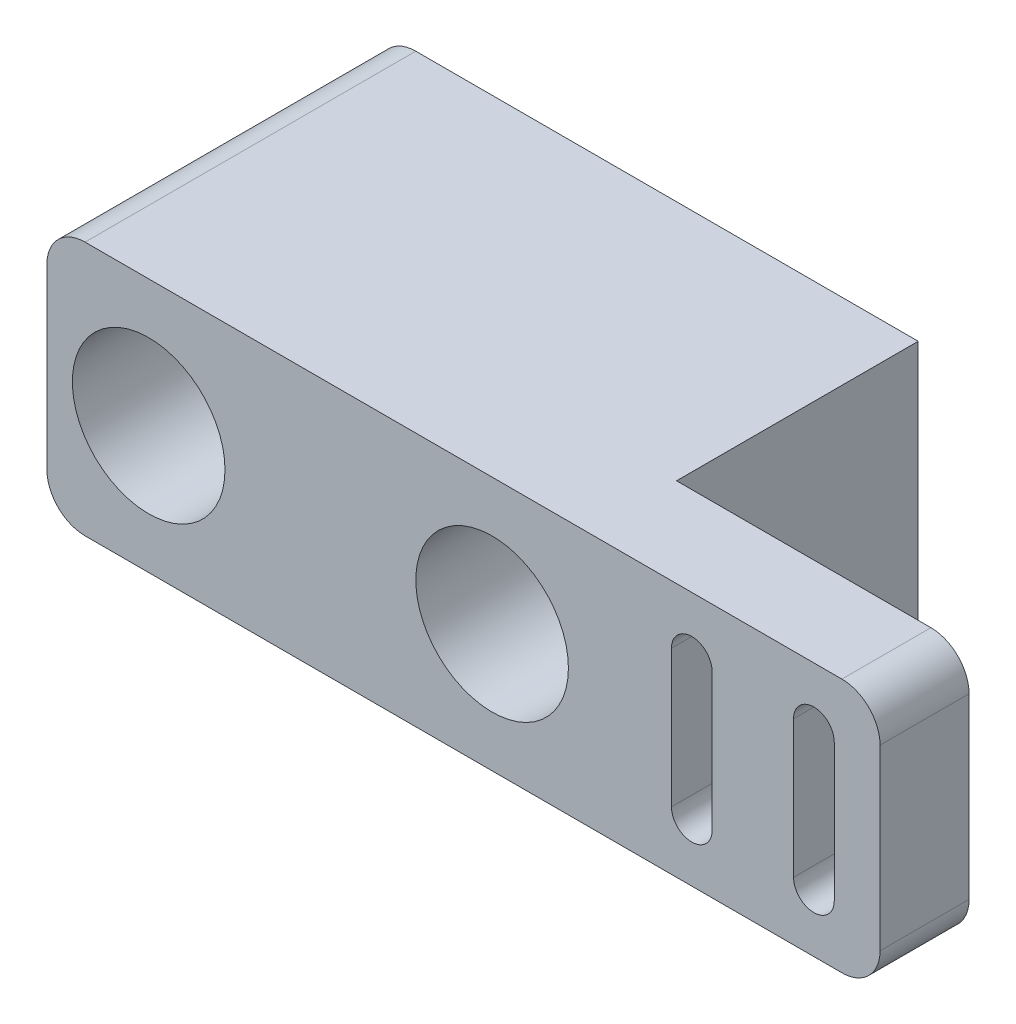
ISO-10303-21;
HEADER;
FILE_DESCRIPTION(('STEP AP214'),'2;1');
FILE_NAME('part.step','',(''),(''),'','','');
FILE_SCHEMA(('AUTOMOTIVE_DESIGN { 1 0 10303 214 1 1 1 1 }'));
ENDSEC;
DATA;
#1=APPLICATION_CONTEXT('core data for automotive mechanical design processes');
#2=APPLICATION_PROTOCOL_DEFINITION('international standard','automotive_design',2000,#1);
#3=PRODUCT_CONTEXT('',#1,'mechanical');
#4=PRODUCT('Part','Part','',(#3));
#5=PRODUCT_RELATED_PRODUCT_CATEGORY('part','',(#4));
#6=PRODUCT_DEFINITION_FORMATION('','',#4);
#7=PRODUCT_DEFINITION_CONTEXT('part definition',#1,'design');
#8=PRODUCT_DEFINITION('design','',#6,#7);
#9=PRODUCT_DEFINITION_SHAPE('','',#8);
#10=(LENGTH_UNIT() NAMED_UNIT(*) SI_UNIT(.MILLI.,.METRE.));
#11=(NAMED_UNIT(*) PLANE_ANGLE_UNIT() SI_UNIT($,.RADIAN.));
#12=(NAMED_UNIT(*) SI_UNIT($,.STERADIAN.) SOLID_ANGLE_UNIT());
#13=UNCERTAINTY_MEASURE_WITH_UNIT(LENGTH_MEASURE(1.E-05),#10,'distance_accuracy_value','');
#14=(GEOMETRIC_REPRESENTATION_CONTEXT(3) GLOBAL_UNCERTAINTY_ASSIGNED_CONTEXT((#13)) GLOBAL_UNIT_ASSIGNED_CONTEXT((#10,
#11,#12)) REPRESENTATION_CONTEXT('',''));
#15=CARTESIAN_POINT('',(0.,0.,0.));
#16=DIRECTION('',(0.,0.,1.));
#17=DIRECTION('',(1.,0.,0.));
#18=AXIS2_PLACEMENT_3D('',#15,#16,#17);
#19=CARTESIAN_POINT('',(35.,10.,-7.));
#20=DIRECTION('',(0.,0.,1.));
#21=DIRECTION('',(1.,0.,0.));
#22=AXIS2_PLACEMENT_3D('',#19,#20,#21);
#23=CYLINDRICAL_SURFACE('',#22,2.6);
#24=CARTESIAN_POINT('',(35.,10.,-26.));
#25=DIRECTION('',(0.,0.,-1.));
#26=DIRECTION('',(-1.,0.,0.));
#27=AXIS2_PLACEMENT_3D('',#24,#25,#26);
#28=CIRCLE('',#27,2.6);
#29=CARTESIAN_POINT('',(32.4,10.,-26.));
#30=VERTEX_POINT('',#29);
#31=EDGE_CURVE('E195',#30,#30,#28,.F.);
#32=ORIENTED_EDGE('',*,*,#31,.F.);
#33=EDGE_LOOP('',(#32));
#34=FACE_BOUND('',#33,.T.);
#35=CARTESIAN_POINT('',(35.,10.,-14.));
#36=DIRECTION('',(0.,0.,1.));
#37=DIRECTION('',(1.,0.,0.));
#38=AXIS2_PLACEMENT_3D('',#35,#36,#37);
#39=CIRCLE('',#38,2.6);
#40=CARTESIAN_POINT('',(37.6,10.,-14.));
#41=VERTEX_POINT('',#40);
#42=EDGE_CURVE('E37',#41,#41,#39,.F.);
#43=ORIENTED_EDGE('',*,*,#42,.F.);
#44=EDGE_LOOP('',(#43));
#45=FACE_BOUND('',#44,.T.);
#46=ADVANCED_FACE('F33',(#34,#45),#23,.F.);
#47=CARTESIAN_POINT('',(8.,10.,-7.));
#48=DIRECTION('',(0.,0.,1.));
#49=DIRECTION('',(1.,0.,0.));
#50=AXIS2_PLACEMENT_3D('',#47,#48,#49);
#51=CYLINDRICAL_SURFACE('',#50,2.6);
#52=CARTESIAN_POINT('',(8.,10.,-26.));
#53=DIRECTION('',(0.,0.,-1.));
#54=DIRECTION('',(-1.,0.,0.));
#55=AXIS2_PLACEMENT_3D('',#52,#53,#54);
#56=CIRCLE('',#55,2.6);
#57=CARTESIAN_POINT('',(5.4,10.,-26.));
#58=VERTEX_POINT('',#57);
#59=EDGE_CURVE('E200',#58,#58,#56,.F.);
#60=ORIENTED_EDGE('',*,*,#59,.F.);
#61=EDGE_LOOP('',(#60));
#62=FACE_BOUND('',#61,.T.);
#63=CARTESIAN_POINT('',(8.,10.,-14.));
#64=DIRECTION('',(0.,0.,1.));
#65=DIRECTION('',(1.,0.,0.));
#66=AXIS2_PLACEMENT_3D('',#63,#64,#65);
#67=CIRCLE('',#66,2.6);
#68=CARTESIAN_POINT('',(10.6,10.,-14.));
#69=VERTEX_POINT('',#68);
#70=EDGE_CURVE('E193',#69,#69,#67,.F.);
#71=ORIENTED_EDGE('',*,*,#70,.F.);
#72=EDGE_LOOP('',(#71));
#73=FACE_BOUND('',#72,.T.);
#74=ADVANCED_FACE('F320',(#62,#73),#51,.F.);
#75=CARTESIAN_POINT('',(62.5,17.,-7.));
#76=DIRECTION('',(0.,0.,1.));
#77=DIRECTION('',(1.,0.,0.));
#78=AXIS2_PLACEMENT_3D('',#75,#76,#77);
#79=CYLINDRICAL_SURFACE('',#78,3.);
#80=CARTESIAN_POINT('',(62.5,17.,0.));
#81=DIRECTION('',(0.,0.,1.));
#82=DIRECTION('',(-1.,0.,0.));
#83=AXIS2_PLACEMENT_3D('',#80,#81,#82);
#84=CIRCLE('',#83,3.);
#85=CARTESIAN_POINT('',(65.5,17.,0.));
#86=VERTEX_POINT('',#85);
#87=CARTESIAN_POINT('',(62.5,20.,0.));
#88=VERTEX_POINT('',#87);
#89=EDGE_CURVE('E246',#86,#88,#84,.T.);
#90=ORIENTED_EDGE('',*,*,#89,.F.);
#91=DIRECTION('',(0.,0.,1.));
#92=VECTOR('',#91,1.);
#93=CARTESIAN_POINT('',(65.5,17.,-7.));
#94=LINE('',#93,#92);
#95=CARTESIAN_POINT('',(65.5,17.,-7.));
#96=VERTEX_POINT('',#95);
#97=EDGE_CURVE('E11',#96,#86,#94,.T.);
#98=ORIENTED_EDGE('',*,*,#97,.F.);
#99=CARTESIAN_POINT('',(62.5,17.,-7.));
#100=DIRECTION('',(0.,0.,1.));
#101=DIRECTION('',(-1.,0.,0.));
#102=AXIS2_PLACEMENT_3D('',#99,#100,#101);
#103=CIRCLE('',#102,3.);
#104=CARTESIAN_POINT('',(62.5,20.,-7.));
#105=VERTEX_POINT('',#104);
#106=EDGE_CURVE('E231',#96,#105,#103,.T.);
#107=ORIENTED_EDGE('',*,*,#106,.T.);
#108=DIRECTION('',(0.,0.,1.));
#109=VECTOR('',#108,1.);
#110=CARTESIAN_POINT('',(62.5,20.,-7.));
#111=LINE('',#110,#109);
#112=EDGE_CURVE('E245',#105,#88,#111,.T.);
#113=ORIENTED_EDGE('',*,*,#112,.T.);
#114=EDGE_LOOP('',(#90,#98,#107,#113));
#115=FACE_BOUND('',#114,.T.);
#116=ADVANCED_FACE('F35',(#115),#79,.T.);
#117=CARTESIAN_POINT('',(65.5000000000001,3.00000000000004,-7.));
#118=DIRECTION('',(1.,0.,0.));
#119=DIRECTION('',(0.,1.,0.));
#120=AXIS2_PLACEMENT_3D('',#117,#118,#119);
#121=PLANE('',#120);
#122=DIRECTION('',(0.,1.,0.));
#123=VECTOR('',#122,1.);
#124=CARTESIAN_POINT('',(65.5000000000001,3.00000000000004,0.));
#125=LINE('',#124,#123);
#126=CARTESIAN_POINT('',(65.5000000000001,3.00000000000004,0.));
#127=VERTEX_POINT('',#126);
#128=EDGE_CURVE('E268',#127,#86,#125,.T.);
#129=ORIENTED_EDGE('',*,*,#128,.F.);
#130=DIRECTION('',(0.,0.,1.));
#131=VECTOR('',#130,1.);
#132=CARTESIAN_POINT('',(65.5000000000001,3.00000000000004,-7.));
#133=LINE('',#132,#131);
#134=CARTESIAN_POINT('',(65.5000000000001,3.00000000000004,-7.));
#135=VERTEX_POINT('',#134);
#136=EDGE_CURVE('E42',#135,#127,#133,.T.);
#137=ORIENTED_EDGE('',*,*,#136,.F.);
#138=DIRECTION('',(0.,1.,0.));
#139=VECTOR('',#138,1.);
#140=CARTESIAN_POINT('',(65.5000000000001,3.00000000000004,-7.));
#141=LINE('',#140,#139);
#142=EDGE_CURVE('E242',#135,#96,#141,.T.);
#143=ORIENTED_EDGE('',*,*,#142,.T.);
#144=ORIENTED_EDGE('',*,*,#97,.T.);
#145=EDGE_LOOP('',(#129,#137,#143,#144));
#146=FACE_BOUND('',#145,.T.);
#147=ADVANCED_FACE('F291',(#146),#121,.T.);
#148=CARTESIAN_POINT('',(62.5000000000001,3.,-7.));
#149=DIRECTION('',(0.,0.,1.));
#150=DIRECTION('',(1.,0.,0.));
#151=AXIS2_PLACEMENT_3D('',#148,#149,#150);
#152=CYLINDRICAL_SURFACE('',#151,3.);
#153=CARTESIAN_POINT('',(62.5000000000001,3.,0.));
#154=DIRECTION('',(0.,0.,1.));
#155=DIRECTION('',(-1.,0.,0.));
#156=AXIS2_PLACEMENT_3D('',#153,#154,#155);
#157=CIRCLE('',#156,3.);
#158=CARTESIAN_POINT('',(62.5000000000001,0.,0.));
#159=VERTEX_POINT('',#158);
#160=EDGE_CURVE('E265',#159,#127,#157,.T.);
#161=ORIENTED_EDGE('',*,*,#160,.F.);
#162=DIRECTION('',(0.,0.,1.));
#163=VECTOR('',#162,1.);
#164=CARTESIAN_POINT('',(62.5000000000001,0.,-7.));
#165=LINE('',#164,#163);
#166=CARTESIAN_POINT('',(62.5000000000001,0.,-7.));
#167=VERTEX_POINT('',#166);
#168=EDGE_CURVE('E272',#167,#159,#165,.T.);
#169=ORIENTED_EDGE('',*,*,#168,.F.);
#170=CARTESIAN_POINT('',(62.5000000000001,3.,-7.));
#171=DIRECTION('',(0.,0.,1.));
#172=DIRECTION('',(-1.,0.,0.));
#173=AXIS2_PLACEMENT_3D('',#170,#171,#172);
#174=CIRCLE('',#173,3.);
#175=EDGE_CURVE('E239',#167,#135,#174,.T.);
#176=ORIENTED_EDGE('',*,*,#175,.T.);
#177=ORIENTED_EDGE('',*,*,#136,.T.);
#178=EDGE_LOOP('',(#161,#169,#176,#177));
#179=FACE_BOUND('',#178,.T.);
#180=ADVANCED_FACE('F298',(#179),#152,.T.);
#181=CARTESIAN_POINT('',(3.00000000000002,0.,-7.));
#182=DIRECTION('',(0.,-1.,0.));
#183=DIRECTION('',(0.,0.,-1.));
#184=AXIS2_PLACEMENT_3D('',#181,#182,#183);
#185=PLANE('',#184);
#186=DIRECTION('',(1.,0.,0.));
#187=VECTOR('',#186,1.);
#188=CARTESIAN_POINT('',(3.00000000000002,0.,0.));
#189=LINE('',#188,#187);
#190=CARTESIAN_POINT('',(3.00000000000002,0.,0.));
#191=VERTEX_POINT('',#190);
#192=EDGE_CURVE('E262',#191,#159,#189,.T.);
#193=ORIENTED_EDGE('',*,*,#192,.F.);
#194=DIRECTION('',(0.,0.,1.));
#195=VECTOR('',#194,1.);
#196=CARTESIAN_POINT('',(3.00000000000002,0.,-7.));
#197=LINE('',#196,#195);
#198=CARTESIAN_POINT('',(3.00000000000002,0.,-26.));
#199=VERTEX_POINT('',#198);
#200=EDGE_CURVE('E274',#199,#191,#197,.T.);
#201=ORIENTED_EDGE('',*,*,#200,.F.);
#202=DIRECTION('',(-1.,0.,0.));
#203=VECTOR('',#202,1.);
#204=CARTESIAN_POINT('',(3.00000000000002,0.,-26.));
#205=LINE('',#204,#203);
#206=CARTESIAN_POINT('',(42.5000000000001,0.,-26.));
#207=VERTEX_POINT('',#206);
#208=EDGE_CURVE('E170',#207,#199,#205,.T.);
#209=ORIENTED_EDGE('',*,*,#208,.F.);
#210=DIRECTION('',(0.,0.,1.));
#211=VECTOR('',#210,1.);
#212=CARTESIAN_POINT('',(42.5000000000001,0.,-26.));
#213=LINE('',#212,#211);
#214=CARTESIAN_POINT('',(42.5000000000001,0.,-7.));
#215=VERTEX_POINT('',#214);
#216=EDGE_CURVE('E166',#207,#215,#213,.T.);
#217=ORIENTED_EDGE('',*,*,#216,.T.);
#218=DIRECTION('',(1.,0.,0.));
#219=VECTOR('',#218,1.);
#220=CARTESIAN_POINT('',(3.00000000000002,0.,-7.));
#221=LINE('',#220,#219);
#222=EDGE_CURVE('E230',#215,#167,#221,.T.);
#223=ORIENTED_EDGE('',*,*,#222,.T.);
#224=ORIENTED_EDGE('',*,*,#168,.T.);
#225=EDGE_LOOP('',(#193,#201,#209,#217,#223,#224));
#226=FACE_BOUND('',#225,.T.);
#227=ADVANCED_FACE('F301',(#226),#185,.T.);
#228=CARTESIAN_POINT('',(3.,3.,-7.));
#229=DIRECTION('',(0.,0.,1.));
#230=DIRECTION('',(1.,0.,0.));
#231=AXIS2_PLACEMENT_3D('',#228,#229,#230);
#232=CYLINDRICAL_SURFACE('',#231,3.);
#233=CARTESIAN_POINT('',(3.,3.,0.));
#234=DIRECTION('',(0.,0.,1.));
#235=DIRECTION('',(-1.,0.,0.));
#236=AXIS2_PLACEMENT_3D('',#233,#234,#235);
#237=CIRCLE('',#236,3.);
#238=CARTESIAN_POINT('',(0.,3.00000000000002,0.));
#239=VERTEX_POINT('',#238);
#240=EDGE_CURVE('E259',#239,#191,#237,.T.);
#241=ORIENTED_EDGE('',*,*,#240,.F.);
#242=DIRECTION('',(0.,0.,1.));
#243=VECTOR('',#242,1.);
#244=CARTESIAN_POINT('',(0.,3.00000000000002,-7.));
#245=LINE('',#244,#243);
#246=CARTESIAN_POINT('',(0.,3.00000000000002,-26.));
#247=VERTEX_POINT('',#246);
#248=EDGE_CURVE('E276',#247,#239,#245,.T.);
#249=ORIENTED_EDGE('',*,*,#248,.F.);
#250=CARTESIAN_POINT('',(3.,3.,-26.));
#251=DIRECTION('',(0.,0.,-1.));
#252=DIRECTION('',(-1.,0.,0.));
#253=AXIS2_PLACEMENT_3D('',#250,#251,#252);
#254=CIRCLE('',#253,3.);
#255=EDGE_CURVE('E216',#199,#247,#254,.T.);
#256=ORIENTED_EDGE('',*,*,#255,.F.);
#257=ORIENTED_EDGE('',*,*,#200,.T.);
#258=EDGE_LOOP('',(#241,#249,#256,#257));
#259=FACE_BOUND('',#258,.T.);
#260=ADVANCED_FACE('F306',(#259),#232,.T.);
#261=CARTESIAN_POINT('',(0.,3.00000000000002,-7.));
#262=DIRECTION('',(-1.,0.,0.));
#263=DIRECTION('',(0.,0.,1.));
#264=AXIS2_PLACEMENT_3D('',#261,#262,#263);
#265=PLANE('',#264);
#266=DIRECTION('',(0.,-1.,0.));
#267=VECTOR('',#266,1.);
#268=CARTESIAN_POINT('',(0.,3.00000000000002,0.));
#269=LINE('',#268,#267);
#270=CARTESIAN_POINT('',(0.,17.,0.));
#271=VERTEX_POINT('',#270);
#272=EDGE_CURVE('E256',#271,#239,#269,.T.);
#273=ORIENTED_EDGE('',*,*,#272,.F.);
#274=DIRECTION('',(0.,0.,1.));
#275=VECTOR('',#274,1.);
#276=CARTESIAN_POINT('',(0.,17.,-7.));
#277=LINE('',#276,#275);
#278=CARTESIAN_POINT('',(0.,17.,-26.));
#279=VERTEX_POINT('',#278);
#280=EDGE_CURVE('E278',#279,#271,#277,.T.);
#281=ORIENTED_EDGE('',*,*,#280,.F.);
#282=DIRECTION('',(0.,1.,0.));
#283=VECTOR('',#282,1.);
#284=CARTESIAN_POINT('',(0.,17.,-26.));
#285=LINE('',#284,#283);
#286=EDGE_CURVE('E219',#247,#279,#285,.T.);
#287=ORIENTED_EDGE('',*,*,#286,.F.);
#288=ORIENTED_EDGE('',*,*,#248,.T.);
#289=EDGE_LOOP('',(#273,#281,#287,#288));
#290=FACE_BOUND('',#289,.T.);
#291=ADVANCED_FACE('F309',(#290),#265,.T.);
#292=CARTESIAN_POINT('',(3.,17.,-7.));
#293=DIRECTION('',(0.,0.,1.));
#294=DIRECTION('',(1.,0.,0.));
#295=AXIS2_PLACEMENT_3D('',#292,#293,#294);
#296=CYLINDRICAL_SURFACE('',#295,3.);
#297=CARTESIAN_POINT('',(3.,17.,0.));
#298=DIRECTION('',(0.,0.,1.));
#299=DIRECTION('',(-1.,0.,0.));
#300=AXIS2_PLACEMENT_3D('',#297,#298,#299);
#301=CIRCLE('',#300,3.);
#302=CARTESIAN_POINT('',(3.00000000000002,20.,0.));
#303=VERTEX_POINT('',#302);
#304=EDGE_CURVE('E253',#303,#271,#301,.T.);
#305=ORIENTED_EDGE('',*,*,#304,.F.);
#306=DIRECTION('',(0.,0.,1.));
#307=VECTOR('',#306,1.);
#308=CARTESIAN_POINT('',(3.00000000000002,20.,-7.));
#309=LINE('',#308,#307);
#310=CARTESIAN_POINT('',(3.00000000000002,20.,-26.));
#311=VERTEX_POINT('',#310);
#312=EDGE_CURVE('E280',#311,#303,#309,.T.);
#313=ORIENTED_EDGE('',*,*,#312,.F.);
#314=CARTESIAN_POINT('',(3.,17.,-26.));
#315=DIRECTION('',(0.,0.,-1.));
#316=DIRECTION('',(-1.,0.,0.));
#317=AXIS2_PLACEMENT_3D('',#314,#315,#316);
#318=CIRCLE('',#317,3.);
#319=EDGE_CURVE('E178',#279,#311,#318,.T.);
#320=ORIENTED_EDGE('',*,*,#319,.F.);
#321=ORIENTED_EDGE('',*,*,#280,.T.);
#322=EDGE_LOOP('',(#305,#313,#320,#321));
#323=FACE_BOUND('',#322,.T.);
#324=ADVANCED_FACE('F311',(#323),#296,.T.);
#325=CARTESIAN_POINT('',(3.00000000000002,20.,-7.));
#326=DIRECTION('',(0.,1.,0.));
#327=DIRECTION('',(0.,0.,1.));
#328=AXIS2_PLACEMENT_3D('',#325,#326,#327);
#329=PLANE('',#328);
#330=DIRECTION('',(-1.,0.,0.));
#331=VECTOR('',#330,1.);
#332=CARTESIAN_POINT('',(3.00000000000002,20.,0.));
#333=LINE('',#332,#331);
#334=EDGE_CURVE('E249',#88,#303,#333,.T.);
#335=ORIENTED_EDGE('',*,*,#334,.F.);
#336=ORIENTED_EDGE('',*,*,#112,.F.);
#337=DIRECTION('',(-1.,0.,0.));
#338=VECTOR('',#337,1.);
#339=CARTESIAN_POINT('',(3.00000000000002,20.,-7.));
#340=LINE('',#339,#338);
#341=CARTESIAN_POINT('',(42.5000000000001,20.,-7.));
#342=VERTEX_POINT('',#341);
#343=EDGE_CURVE('E183',#105,#342,#340,.T.);
#344=ORIENTED_EDGE('',*,*,#343,.T.);
#345=DIRECTION('',(0.,0.,1.));
#346=VECTOR('',#345,1.);
#347=CARTESIAN_POINT('',(42.5000000000001,20.,-26.));
#348=LINE('',#347,#346);
#349=CARTESIAN_POINT('',(42.5000000000001,20.,-26.));
#350=VERTEX_POINT('',#349);
#351=EDGE_CURVE('E164',#350,#342,#348,.T.);
#352=ORIENTED_EDGE('',*,*,#351,.F.);
#353=DIRECTION('',(1.,0.,0.));
#354=VECTOR('',#353,1.);
#355=CARTESIAN_POINT('',(42.5000000000001,20.,-26.));
#356=LINE('',#355,#354);
#357=EDGE_CURVE('E171',#311,#350,#356,.T.);
#358=ORIENTED_EDGE('',*,*,#357,.F.);
#359=ORIENTED_EDGE('',*,*,#312,.T.);
#360=EDGE_LOOP('',(#335,#336,#344,#352,#358,#359));
#361=FACE_BOUND('',#360,.T.);
#362=ADVANCED_FACE('F182',(#361),#329,.T.);
#363=CARTESIAN_POINT('',(62.5,17.,-7.));
#364=DIRECTION('',(0.,0.,-1.));
#365=DIRECTION('',(-1.,0.,0.));
#366=AXIS2_PLACEMENT_3D('',#363,#364,#365);
#367=PLANE('',#366);
#368=DIRECTION('',(0.,-1.,0.));
#369=VECTOR('',#368,1.);
#370=CARTESIAN_POINT('',(42.5000000000001,20.,-7.));
#371=LINE('',#370,#369);
#372=EDGE_CURVE('E50',#342,#215,#371,.T.);
#373=ORIENTED_EDGE('',*,*,#372,.F.);
#374=ORIENTED_EDGE('',*,*,#343,.F.);
#375=ORIENTED_EDGE('',*,*,#106,.F.);
#376=ORIENTED_EDGE('',*,*,#142,.F.);
#377=ORIENTED_EDGE('',*,*,#175,.F.);
#378=ORIENTED_EDGE('',*,*,#222,.F.);
#379=EDGE_LOOP('',(#373,#374,#375,#376,#377,#378));
#380=FACE_BOUND('',#379,.T.);
#381=CARTESIAN_POINT('',(60.3,15.4,-7.));
#382=DIRECTION('',(0.,0.,1.));
#383=DIRECTION('',(1.,0.,0.));
#384=AXIS2_PLACEMENT_3D('',#381,#382,#383);
#385=CIRCLE('',#384,1.6);
#386=CARTESIAN_POINT('',(61.9,15.4,-7.));
#387=VERTEX_POINT('',#386);
#388=CARTESIAN_POINT('',(58.7,15.4,-7.));
#389=VERTEX_POINT('',#388);
#390=EDGE_CURVE('E224',#387,#389,#385,.T.);
#391=ORIENTED_EDGE('',*,*,#390,.T.);
#392=DIRECTION('',(0.,-1.,0.));
#393=VECTOR('',#392,1.);
#394=CARTESIAN_POINT('',(58.7,15.4,-7.));
#395=LINE('',#394,#393);
#396=CARTESIAN_POINT('',(58.7,4.6,-7.));
#397=VERTEX_POINT('',#396);
#398=EDGE_CURVE('E556',#389,#397,#395,.T.);
#399=ORIENTED_EDGE('',*,*,#398,.T.);
#400=CARTESIAN_POINT('',(60.3,4.6,-7.));
#401=DIRECTION('',(0.,0.,1.));
#402=DIRECTION('',(1.,0.,0.));
#403=AXIS2_PLACEMENT_3D('',#400,#401,#402);
#404=CIRCLE('',#403,1.6);
#405=CARTESIAN_POINT('',(61.9,4.6,-7.));
#406=VERTEX_POINT('',#405);
#407=EDGE_CURVE('E58',#397,#406,#404,.T.);
#408=ORIENTED_EDGE('',*,*,#407,.T.);
#409=DIRECTION('',(0.,1.,0.));
#410=VECTOR('',#409,1.);
#411=CARTESIAN_POINT('',(61.9,15.4,-7.));
#412=LINE('',#411,#410);
#413=EDGE_CURVE('E542',#406,#387,#412,.T.);
#414=ORIENTED_EDGE('',*,*,#413,.T.);
#415=EDGE_LOOP('',(#391,#399,#408,#414));
#416=FACE_BOUND('',#415,.T.);
#417=CARTESIAN_POINT('',(50.7,15.4,-7.));
#418=DIRECTION('',(0.,0.,1.));
#419=DIRECTION('',(1.,0.,0.));
#420=AXIS2_PLACEMENT_3D('',#417,#418,#419);
#421=CIRCLE('',#420,1.6);
#422=CARTESIAN_POINT('',(52.3,15.4,-7.));
#423=VERTEX_POINT('',#422);
#424=CARTESIAN_POINT('',(49.1,15.4,-7.));
#425=VERTEX_POINT('',#424);
#426=EDGE_CURVE('E518',#423,#425,#421,.T.);
#427=ORIENTED_EDGE('',*,*,#426,.T.);
#428=DIRECTION('',(0.,-1.,0.));
#429=VECTOR('',#428,1.);
#430=CARTESIAN_POINT('',(49.1,15.4,-7.));
#431=LINE('',#430,#429);
#432=CARTESIAN_POINT('',(49.1,4.6,-7.));
#433=VERTEX_POINT('',#432);
#434=EDGE_CURVE('E532',#425,#433,#431,.T.);
#435=ORIENTED_EDGE('',*,*,#434,.T.);
#436=CARTESIAN_POINT('',(50.7,4.6,-7.));
#437=DIRECTION('',(0.,0.,1.));
#438=DIRECTION('',(1.,0.,0.));
#439=AXIS2_PLACEMENT_3D('',#436,#437,#438);
#440=CIRCLE('',#439,1.6);
#441=CARTESIAN_POINT('',(52.3,4.6,-7.));
#442=VERTEX_POINT('',#441);
#443=EDGE_CURVE('E527',#433,#442,#440,.T.);
#444=ORIENTED_EDGE('',*,*,#443,.T.);
#445=DIRECTION('',(0.,1.,0.));
#446=VECTOR('',#445,1.);
#447=CARTESIAN_POINT('',(52.3,15.4,-7.));
#448=LINE('',#447,#446);
#449=EDGE_CURVE('E524',#442,#423,#448,.T.);
#450=ORIENTED_EDGE('',*,*,#449,.T.);
#451=EDGE_LOOP('',(#427,#435,#444,#450));
#452=FACE_BOUND('',#451,.T.);
#453=ADVANCED_FACE('F293',(#380,#416,#452),#367,.T.);
#454=CARTESIAN_POINT('',(62.5,17.,0.));
#455=DIRECTION('',(0.,0.,-1.));
#456=DIRECTION('',(-1.,0.,0.));
#457=AXIS2_PLACEMENT_3D('',#454,#455,#456);
#458=PLANE('',#457);
#459=CARTESIAN_POINT('',(35.,10.,0.));
#460=DIRECTION('',(0.,0.,1.));
#461=DIRECTION('',(1.,0.,0.));
#462=AXIS2_PLACEMENT_3D('',#459,#460,#461);
#463=CIRCLE('',#462,6.);
#464=CARTESIAN_POINT('',(41.,10.,0.));
#465=VERTEX_POINT('',#464);
#466=EDGE_CURVE('E210',#465,#465,#463,.T.);
#467=ORIENTED_EDGE('',*,*,#466,.F.);
#468=EDGE_LOOP('',(#467));
#469=FACE_BOUND('',#468,.T.);
#470=CARTESIAN_POINT('',(8.,10.,0.));
#471=DIRECTION('',(0.,0.,1.));
#472=DIRECTION('',(1.,0.,0.));
#473=AXIS2_PLACEMENT_3D('',#470,#471,#472);
#474=CIRCLE('',#473,6.);
#475=CARTESIAN_POINT('',(14.,10.,0.));
#476=VERTEX_POINT('',#475);
#477=EDGE_CURVE('E203',#476,#476,#474,.T.);
#478=ORIENTED_EDGE('',*,*,#477,.F.);
#479=EDGE_LOOP('',(#478));
#480=FACE_BOUND('',#479,.T.);
#481=DIRECTION('',(0.,-1.,0.));
#482=VECTOR('',#481,1.);
#483=CARTESIAN_POINT('',(58.7,15.4,0.));
#484=LINE('',#483,#482);
#485=CARTESIAN_POINT('',(58.7,15.4,0.));
#486=VERTEX_POINT('',#485);
#487=CARTESIAN_POINT('',(58.7,4.6,0.));
#488=VERTEX_POINT('',#487);
#489=EDGE_CURVE('E186',#486,#488,#484,.T.);
#490=ORIENTED_EDGE('',*,*,#489,.F.);
#491=CARTESIAN_POINT('',(60.3,15.4,0.));
#492=DIRECTION('',(0.,0.,1.));
#493=DIRECTION('',(1.,0.,0.));
#494=AXIS2_PLACEMENT_3D('',#491,#492,#493);
#495=CIRCLE('',#494,1.6);
#496=CARTESIAN_POINT('',(61.9,15.4,0.));
#497=VERTEX_POINT('',#496);
#498=EDGE_CURVE('E184',#497,#486,#495,.T.);
#499=ORIENTED_EDGE('',*,*,#498,.F.);
#500=DIRECTION('',(0.,1.,0.));
#501=VECTOR('',#500,1.);
#502=CARTESIAN_POINT('',(61.9,15.4,0.));
#503=LINE('',#502,#501);
#504=CARTESIAN_POINT('',(61.9,4.6,0.));
#505=VERTEX_POINT('',#504);
#506=EDGE_CURVE('E547',#505,#497,#503,.T.);
#507=ORIENTED_EDGE('',*,*,#506,.F.);
#508=CARTESIAN_POINT('',(60.3,4.6,0.));
#509=DIRECTION('',(0.,0.,1.));
#510=DIRECTION('',(1.,0.,0.));
#511=AXIS2_PLACEMENT_3D('',#508,#509,#510);
#512=CIRCLE('',#511,1.6);
#513=EDGE_CURVE('E550',#488,#505,#512,.T.);
#514=ORIENTED_EDGE('',*,*,#513,.F.);
#515=EDGE_LOOP('',(#490,#499,#507,#514));
#516=FACE_BOUND('',#515,.T.);
#517=DIRECTION('',(0.,-1.,0.));
#518=VECTOR('',#517,1.);
#519=CARTESIAN_POINT('',(49.1,15.4,0.));
#520=LINE('',#519,#518);
#521=CARTESIAN_POINT('',(49.1,15.4,0.));
#522=VERTEX_POINT('',#521);
#523=CARTESIAN_POINT('',(49.1,4.6,0.));
#524=VERTEX_POINT('',#523);
#525=EDGE_CURVE('E502',#522,#524,#520,.T.);
#526=ORIENTED_EDGE('',*,*,#525,.F.);
#527=CARTESIAN_POINT('',(50.7,15.4,0.));
#528=DIRECTION('',(0.,0.,1.));
#529=DIRECTION('',(1.,0.,0.));
#530=AXIS2_PLACEMENT_3D('',#527,#528,#529);
#531=CIRCLE('',#530,1.6);
#532=CARTESIAN_POINT('',(52.3,15.4,0.));
#533=VERTEX_POINT('',#532);
#534=EDGE_CURVE('E504',#533,#522,#531,.T.);
#535=ORIENTED_EDGE('',*,*,#534,.F.);
#536=DIRECTION('',(0.,1.,0.));
#537=VECTOR('',#536,1.);
#538=CARTESIAN_POINT('',(52.3,15.4,0.));
#539=LINE('',#538,#537);
#540=CARTESIAN_POINT('',(52.3,4.6,0.));
#541=VERTEX_POINT('',#540);
#542=EDGE_CURVE('E510',#541,#533,#539,.T.);
#543=ORIENTED_EDGE('',*,*,#542,.F.);
#544=CARTESIAN_POINT('',(50.7,4.6,0.));
#545=DIRECTION('',(0.,0.,1.));
#546=DIRECTION('',(1.,0.,0.));
#547=AXIS2_PLACEMENT_3D('',#544,#545,#546);
#548=CIRCLE('',#547,1.6);
#549=EDGE_CURVE('E506',#524,#541,#548,.T.);
#550=ORIENTED_EDGE('',*,*,#549,.F.);
#551=EDGE_LOOP('',(#526,#535,#543,#550));
#552=FACE_BOUND('',#551,.T.);
#553=ORIENTED_EDGE('',*,*,#89,.T.);
#554=ORIENTED_EDGE('',*,*,#334,.T.);
#555=ORIENTED_EDGE('',*,*,#304,.T.);
#556=ORIENTED_EDGE('',*,*,#272,.T.);
#557=ORIENTED_EDGE('',*,*,#240,.T.);
#558=ORIENTED_EDGE('',*,*,#192,.T.);
#559=ORIENTED_EDGE('',*,*,#160,.T.);
#560=ORIENTED_EDGE('',*,*,#128,.T.);
#561=EDGE_LOOP('',(#553,#554,#555,#556,#557,#558,#559,#560));
#562=FACE_BOUND('',#561,.T.);
#563=ADVANCED_FACE('F287',(#469,#480,#516,#552,#562),#458,.F.);
#564=CARTESIAN_POINT('',(50.7,15.4,-7.));
#565=DIRECTION('',(0.,0.,1.));
#566=DIRECTION('',(1.,0.,0.));
#567=AXIS2_PLACEMENT_3D('',#564,#565,#566);
#568=CYLINDRICAL_SURFACE('',#567,1.6);
#569=ORIENTED_EDGE('',*,*,#534,.T.);
#570=DIRECTION('',(0.,0.,1.));
#571=VECTOR('',#570,1.);
#572=CARTESIAN_POINT('',(49.1,15.4,-7.));
#573=LINE('',#572,#571);
#574=EDGE_CURVE('E523',#425,#522,#573,.T.);
#575=ORIENTED_EDGE('',*,*,#574,.F.);
#576=ORIENTED_EDGE('',*,*,#426,.F.);
#577=DIRECTION('',(0.,0.,1.));
#578=VECTOR('',#577,1.);
#579=CARTESIAN_POINT('',(52.3,15.4,-7.));
#580=LINE('',#579,#578);
#581=EDGE_CURVE('E250',#423,#533,#580,.T.);
#582=ORIENTED_EDGE('',*,*,#581,.T.);
#583=EDGE_LOOP('',(#569,#575,#576,#582));
#584=FACE_BOUND('',#583,.T.);
#585=ADVANCED_FACE('F353',(#584),#568,.F.);
#586=CARTESIAN_POINT('',(52.3,15.4,-7.));
#587=DIRECTION('',(1.,0.,0.));
#588=DIRECTION('',(0.,0.,-1.));
#589=AXIS2_PLACEMENT_3D('',#586,#587,#588);
#590=PLANE('',#589);
#591=ORIENTED_EDGE('',*,*,#542,.T.);
#592=ORIENTED_EDGE('',*,*,#581,.F.);
#593=ORIENTED_EDGE('',*,*,#449,.F.);
#594=DIRECTION('',(0.,0.,1.));
#595=VECTOR('',#594,1.);
#596=CARTESIAN_POINT('',(52.3,4.6,-7.));
#597=LINE('',#596,#595);
#598=EDGE_CURVE('E520',#442,#541,#597,.T.);
#599=ORIENTED_EDGE('',*,*,#598,.T.);
#600=EDGE_LOOP('',(#591,#592,#593,#599));
#601=FACE_BOUND('',#600,.T.);
#602=ADVANCED_FACE('F349',(#601),#590,.F.);
#603=CARTESIAN_POINT('',(50.7,4.6,-7.));
#604=DIRECTION('',(0.,0.,1.));
#605=DIRECTION('',(1.,0.,0.));
#606=AXIS2_PLACEMENT_3D('',#603,#604,#605);
#607=CYLINDRICAL_SURFACE('',#606,1.6);
#608=ORIENTED_EDGE('',*,*,#549,.T.);
#609=ORIENTED_EDGE('',*,*,#598,.F.);
#610=ORIENTED_EDGE('',*,*,#443,.F.);
#611=DIRECTION('',(0.,0.,1.));
#612=VECTOR('',#611,1.);
#613=CARTESIAN_POINT('',(49.1,4.6,-7.));
#614=LINE('',#613,#612);
#615=EDGE_CURVE('E522',#433,#524,#614,.T.);
#616=ORIENTED_EDGE('',*,*,#615,.T.);
#617=EDGE_LOOP('',(#608,#609,#610,#616));
#618=FACE_BOUND('',#617,.T.);
#619=ADVANCED_FACE('F352',(#618),#607,.F.);
#620=CARTESIAN_POINT('',(49.1,15.4,-7.));
#621=DIRECTION('',(-1.,0.,0.));
#622=DIRECTION('',(0.,0.,1.));
#623=AXIS2_PLACEMENT_3D('',#620,#621,#622);
#624=PLANE('',#623);
#625=ORIENTED_EDGE('',*,*,#525,.T.);
#626=ORIENTED_EDGE('',*,*,#615,.F.);
#627=ORIENTED_EDGE('',*,*,#434,.F.);
#628=ORIENTED_EDGE('',*,*,#574,.T.);
#629=EDGE_LOOP('',(#625,#626,#627,#628));
#630=FACE_BOUND('',#629,.T.);
#631=ADVANCED_FACE('F347',(#630),#624,.F.);
#632=CARTESIAN_POINT('',(60.3,15.4,-7.));
#633=DIRECTION('',(0.,0.,1.));
#634=DIRECTION('',(1.,0.,0.));
#635=AXIS2_PLACEMENT_3D('',#632,#633,#634);
#636=CYLINDRICAL_SURFACE('',#635,1.6);
#637=ORIENTED_EDGE('',*,*,#498,.T.);
#638=DIRECTION('',(0.,0.,1.));
#639=VECTOR('',#638,1.);
#640=CARTESIAN_POINT('',(58.7,15.4,-7.));
#641=LINE('',#640,#639);
#642=EDGE_CURVE('E538',#389,#486,#641,.T.);
#643=ORIENTED_EDGE('',*,*,#642,.F.);
#644=ORIENTED_EDGE('',*,*,#390,.F.);
#645=DIRECTION('',(0.,0.,1.));
#646=VECTOR('',#645,1.);
#647=CARTESIAN_POINT('',(61.9,15.4,-7.));
#648=LINE('',#647,#646);
#649=EDGE_CURVE('E512',#387,#497,#648,.T.);
#650=ORIENTED_EDGE('',*,*,#649,.T.);
#651=EDGE_LOOP('',(#637,#643,#644,#650));
#652=FACE_BOUND('',#651,.T.);
#653=ADVANCED_FACE('F337',(#652),#636,.F.);
#654=CARTESIAN_POINT('',(61.9,15.4,-7.));
#655=DIRECTION('',(1.,0.,0.));
#656=DIRECTION('',(0.,0.,-1.));
#657=AXIS2_PLACEMENT_3D('',#654,#655,#656);
#658=PLANE('',#657);
#659=ORIENTED_EDGE('',*,*,#506,.T.);
#660=ORIENTED_EDGE('',*,*,#649,.F.);
#661=ORIENTED_EDGE('',*,*,#413,.F.);
#662=DIRECTION('',(0.,0.,1.));
#663=VECTOR('',#662,1.);
#664=CARTESIAN_POINT('',(61.9,4.6,-7.));
#665=LINE('',#664,#663);
#666=EDGE_CURVE('E544',#406,#505,#665,.T.);
#667=ORIENTED_EDGE('',*,*,#666,.T.);
#668=EDGE_LOOP('',(#659,#660,#661,#667));
#669=FACE_BOUND('',#668,.T.);
#670=ADVANCED_FACE('F333',(#669),#658,.F.);
#671=CARTESIAN_POINT('',(60.3,4.6,-7.));
#672=DIRECTION('',(0.,0.,1.));
#673=DIRECTION('',(1.,0.,0.));
#674=AXIS2_PLACEMENT_3D('',#671,#672,#673);
#675=CYLINDRICAL_SURFACE('',#674,1.6);
#676=ORIENTED_EDGE('',*,*,#513,.T.);
#677=ORIENTED_EDGE('',*,*,#666,.F.);
#678=ORIENTED_EDGE('',*,*,#407,.F.);
#679=DIRECTION('',(0.,0.,1.));
#680=VECTOR('',#679,1.);
#681=CARTESIAN_POINT('',(58.7,4.6,-7.));
#682=LINE('',#681,#680);
#683=EDGE_CURVE('E541',#397,#488,#682,.T.);
#684=ORIENTED_EDGE('',*,*,#683,.T.);
#685=EDGE_LOOP('',(#676,#677,#678,#684));
#686=FACE_BOUND('',#685,.T.);
#687=ADVANCED_FACE('F336',(#686),#675,.F.);
#688=CARTESIAN_POINT('',(58.7,15.4,-7.));
#689=DIRECTION('',(-1.,0.,0.));
#690=DIRECTION('',(0.,0.,1.));
#691=AXIS2_PLACEMENT_3D('',#688,#689,#690);
#692=PLANE('',#691);
#693=ORIENTED_EDGE('',*,*,#489,.T.);
#694=ORIENTED_EDGE('',*,*,#683,.F.);
#695=ORIENTED_EDGE('',*,*,#398,.F.);
#696=ORIENTED_EDGE('',*,*,#642,.T.);
#697=EDGE_LOOP('',(#693,#694,#695,#696));
#698=FACE_BOUND('',#697,.T.);
#699=ADVANCED_FACE('F341',(#698),#692,.F.);
#700=CARTESIAN_POINT('',(3.,17.,-26.));
#701=DIRECTION('',(0.,0.,-1.));
#702=DIRECTION('',(-1.,0.,0.));
#703=AXIS2_PLACEMENT_3D('',#700,#701,#702);
#704=PLANE('',#703);
#705=ORIENTED_EDGE('',*,*,#31,.T.);
#706=EDGE_LOOP('',(#705));
#707=FACE_BOUND('',#706,.T.);
#708=ORIENTED_EDGE('',*,*,#59,.T.);
#709=EDGE_LOOP('',(#708));
#710=FACE_BOUND('',#709,.T.);
#711=ORIENTED_EDGE('',*,*,#357,.T.);
#712=DIRECTION('',(0.,-1.,0.));
#713=VECTOR('',#712,1.);
#714=CARTESIAN_POINT('',(42.5000000000001,20.,-26.));
#715=LINE('',#714,#713);
#716=EDGE_CURVE('E160',#350,#207,#715,.T.);
#717=ORIENTED_EDGE('',*,*,#716,.T.);
#718=ORIENTED_EDGE('',*,*,#208,.T.);
#719=ORIENTED_EDGE('',*,*,#255,.T.);
#720=ORIENTED_EDGE('',*,*,#286,.T.);
#721=ORIENTED_EDGE('',*,*,#319,.T.);
#722=EDGE_LOOP('',(#711,#717,#718,#719,#720,#721));
#723=FACE_BOUND('',#722,.T.);
#724=ADVANCED_FACE('F175',(#707,#710,#723),#704,.T.);
#725=CARTESIAN_POINT('',(42.5000000000001,20.,-26.));
#726=DIRECTION('',(-1.,0.,0.));
#727=DIRECTION('',(0.,0.,1.));
#728=AXIS2_PLACEMENT_3D('',#725,#726,#727);
#729=PLANE('',#728);
#730=ORIENTED_EDGE('',*,*,#372,.T.);
#731=ORIENTED_EDGE('',*,*,#216,.F.);
#732=ORIENTED_EDGE('',*,*,#716,.F.);
#733=ORIENTED_EDGE('',*,*,#351,.T.);
#734=EDGE_LOOP('',(#730,#731,#732,#733));
#735=FACE_BOUND('',#734,.T.);
#736=ADVANCED_FACE('F162',(#735),#729,.F.);
#737=CARTESIAN_POINT('',(8.,10.,-14.));
#738=DIRECTION('',(0.,0.,1.));
#739=DIRECTION('',(1.,0.,0.));
#740=AXIS2_PLACEMENT_3D('',#737,#738,#739);
#741=PLANE('',#740);
#742=CARTESIAN_POINT('',(8.,10.,-14.));
#743=DIRECTION('',(0.,0.,1.));
#744=DIRECTION('',(1.,0.,0.));
#745=AXIS2_PLACEMENT_3D('',#742,#743,#744);
#746=CIRCLE('',#745,6.);
#747=CARTESIAN_POINT('',(14.,10.,-14.));
#748=VERTEX_POINT('',#747);
#749=EDGE_CURVE('E196',#748,#748,#746,.T.);
#750=ORIENTED_EDGE('',*,*,#749,.T.);
#751=EDGE_LOOP('',(#750));
#752=FACE_BOUND('',#751,.T.);
#753=ORIENTED_EDGE('',*,*,#70,.T.);
#754=EDGE_LOOP('',(#753));
#755=FACE_BOUND('',#754,.T.);
#756=ADVANCED_FACE('F414',(#752,#755),#741,.T.);
#757=CARTESIAN_POINT('',(8.,10.,-14.));
#758=DIRECTION('',(0.,0.,1.));
#759=DIRECTION('',(1.,0.,0.));
#760=AXIS2_PLACEMENT_3D('',#757,#758,#759);
#761=CYLINDRICAL_SURFACE('',#760,6.);
#762=ORIENTED_EDGE('',*,*,#749,.F.);
#763=EDGE_LOOP('',(#762));
#764=FACE_BOUND('',#763,.T.);
#765=ORIENTED_EDGE('',*,*,#477,.T.);
#766=EDGE_LOOP('',(#765));
#767=FACE_BOUND('',#766,.T.);
#768=ADVANCED_FACE('F448',(#764,#767),#761,.F.);
#769=CARTESIAN_POINT('',(35.,10.,-14.));
#770=DIRECTION('',(0.,0.,1.));
#771=DIRECTION('',(1.,0.,0.));
#772=AXIS2_PLACEMENT_3D('',#769,#770,#771);
#773=PLANE('',#772);
#774=CARTESIAN_POINT('',(35.,10.,-14.));
#775=DIRECTION('',(0.,0.,1.));
#776=DIRECTION('',(1.,0.,0.));
#777=AXIS2_PLACEMENT_3D('',#774,#775,#776);
#778=CIRCLE('',#777,6.);
#779=CARTESIAN_POINT('',(41.,10.,-14.));
#780=VERTEX_POINT('',#779);
#781=EDGE_CURVE('E484',#780,#780,#778,.T.);
#782=ORIENTED_EDGE('',*,*,#781,.T.);
#783=EDGE_LOOP('',(#782));
#784=FACE_BOUND('',#783,.T.);
#785=ORIENTED_EDGE('',*,*,#42,.T.);
#786=EDGE_LOOP('',(#785));
#787=FACE_BOUND('',#786,.T.);
#788=ADVANCED_FACE('F457',(#784,#787),#773,.T.);
#789=CARTESIAN_POINT('',(35.,10.,-14.));
#790=DIRECTION('',(0.,0.,1.));
#791=DIRECTION('',(1.,0.,0.));
#792=AXIS2_PLACEMENT_3D('',#789,#790,#791);
#793=CYLINDRICAL_SURFACE('',#792,6.);
#794=ORIENTED_EDGE('',*,*,#781,.F.);
#795=EDGE_LOOP('',(#794));
#796=FACE_BOUND('',#795,.T.);
#797=ORIENTED_EDGE('',*,*,#466,.T.);
#798=EDGE_LOOP('',(#797));
#799=FACE_BOUND('',#798,.T.);
#800=ADVANCED_FACE('F467',(#796,#799),#793,.F.);
#801=CLOSED_SHELL('',(#46,#74,#116,#147,#180,#227,#260,#291,#324,#362,#453,#563,#585,#602,#619,
#631,#653,#670,#687,#699,#724,#736,#756,#768,#788,#800));
#802=MANIFOLD_SOLID_BREP('B2',#801);
#803=ADVANCED_BREP_SHAPE_REPRESENTATION('',(#18,#802),#14);
#804=SHAPE_DEFINITION_REPRESENTATION(#9,#803);
ENDSEC;
END-ISO-10303-21;
